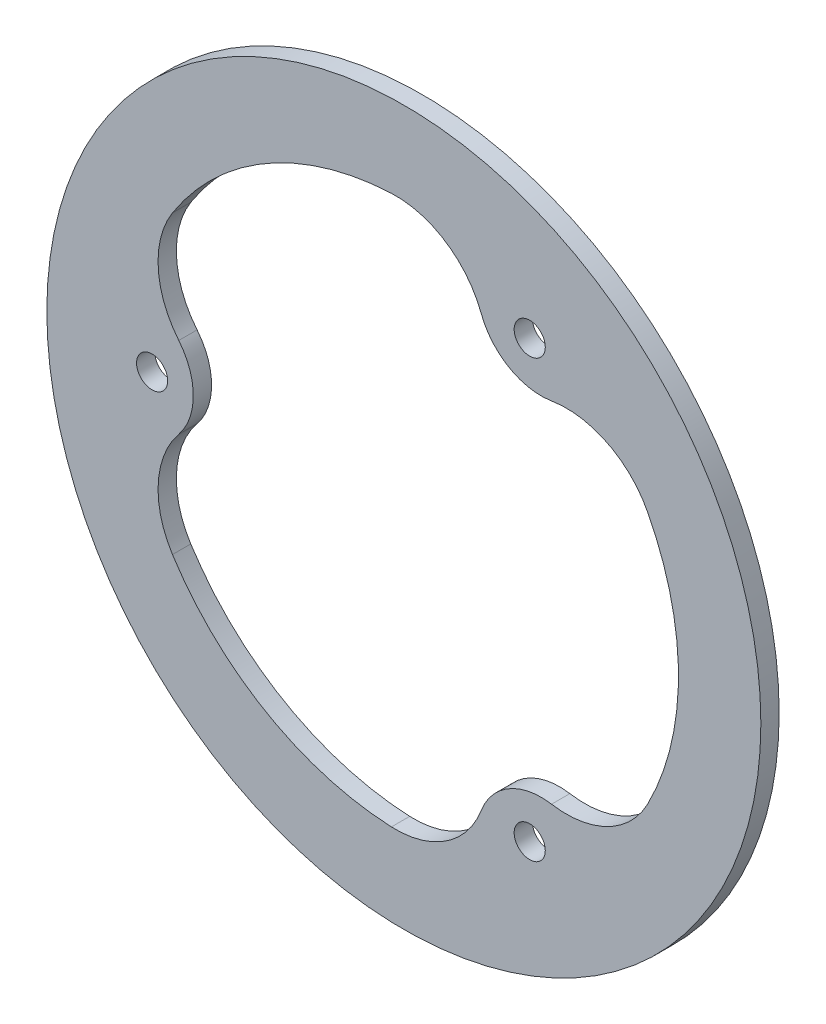
ISO-10303-21;
HEADER;
FILE_DESCRIPTION(('STEP AP214'),'2;1');
FILE_NAME('part.step','',(''),(''),'','','');
FILE_SCHEMA(('AUTOMOTIVE_DESIGN { 1 0 10303 214 1 1 1 1 }'));
ENDSEC;
DATA;
#1=APPLICATION_CONTEXT('core data for automotive mechanical design processes');
#2=APPLICATION_PROTOCOL_DEFINITION('international standard','automotive_design',2000,#1);
#3=PRODUCT_CONTEXT('',#1,'mechanical');
#4=PRODUCT('Part','Part','',(#3));
#5=PRODUCT_RELATED_PRODUCT_CATEGORY('part','',(#4));
#6=PRODUCT_DEFINITION_FORMATION('','',#4);
#7=PRODUCT_DEFINITION_CONTEXT('part definition',#1,'design');
#8=PRODUCT_DEFINITION('design','',#6,#7);
#9=PRODUCT_DEFINITION_SHAPE('','',#8);
#10=(LENGTH_UNIT() NAMED_UNIT(*) SI_UNIT(.MILLI.,.METRE.));
#11=(NAMED_UNIT(*) PLANE_ANGLE_UNIT() SI_UNIT($,.RADIAN.));
#12=(NAMED_UNIT(*) SI_UNIT($,.STERADIAN.) SOLID_ANGLE_UNIT());
#13=UNCERTAINTY_MEASURE_WITH_UNIT(LENGTH_MEASURE(1.E-05),#10,'distance_accuracy_value','');
#14=(GEOMETRIC_REPRESENTATION_CONTEXT(3) GLOBAL_UNCERTAINTY_ASSIGNED_CONTEXT((#13)) GLOBAL_UNIT_ASSIGNED_CONTEXT((#10,
#11,#12)) REPRESENTATION_CONTEXT('',''));
#15=CARTESIAN_POINT('',(0.,0.,0.));
#16=DIRECTION('',(0.,0.,1.));
#17=DIRECTION('',(1.,0.,0.));
#18=AXIS2_PLACEMENT_3D('',#15,#16,#17);
#19=CARTESIAN_POINT('',(0.,0.,2.));
#20=DIRECTION('',(0.,0.,1.));
#21=DIRECTION('',(1.,0.,0.));
#22=AXIS2_PLACEMENT_3D('',#19,#20,#21);
#23=PLANE('',#22);
#24=CARTESIAN_POINT('',(13.7499999999999,23.8156986040721,2.));
#25=DIRECTION('',(0.,0.,1.));
#26=DIRECTION('',(1.,0.,0.));
#27=AXIS2_PLACEMENT_3D('',#24,#25,#26);
#28=CIRCLE('',#27,1.69999999999999);
#29=CARTESIAN_POINT('',(15.4499999999999,23.8156986040721,2.));
#30=VERTEX_POINT('',#29);
#31=EDGE_CURVE('E370',#30,#30,#28,.T.);
#32=ORIENTED_EDGE('',*,*,#31,.F.);
#33=EDGE_LOOP('',(#32));
#34=FACE_BOUND('',#33,.T.);
#35=CARTESIAN_POINT('',(-27.5,0.,2.));
#36=DIRECTION('',(0.,0.,1.));
#37=DIRECTION('',(1.,0.,0.));
#38=AXIS2_PLACEMENT_3D('',#35,#36,#37);
#39=CIRCLE('',#38,1.69999999999999);
#40=CARTESIAN_POINT('',(-25.8,0.,2.));
#41=VERTEX_POINT('',#40);
#42=EDGE_CURVE('E372',#41,#41,#39,.T.);
#43=ORIENTED_EDGE('',*,*,#42,.F.);
#44=EDGE_LOOP('',(#43));
#45=FACE_BOUND('',#44,.T.);
#46=CARTESIAN_POINT('',(13.7499999999999,-23.8156986040721,2.));
#47=DIRECTION('',(0.,0.,1.));
#48=DIRECTION('',(1.,0.,0.));
#49=AXIS2_PLACEMENT_3D('',#46,#47,#48);
#50=CIRCLE('',#49,1.69999999999999);
#51=CARTESIAN_POINT('',(15.4499999999999,-23.8156986040721,2.));
#52=VERTEX_POINT('',#51);
#53=EDGE_CURVE('E379',#52,#52,#50,.T.);
#54=ORIENTED_EDGE('',*,*,#53,.F.);
#55=EDGE_LOOP('',(#54));
#56=FACE_BOUND('',#55,.T.);
#57=CARTESIAN_POINT('',(0.,0.,2.));
#58=DIRECTION('',(0.,0.,1.));
#59=DIRECTION('',(1.,0.,0.));
#60=AXIS2_PLACEMENT_3D('',#57,#58,#59);
#61=CIRCLE('',#60,39.);
#62=CARTESIAN_POINT('',(39.,0.,2.));
#63=VERTEX_POINT('',#62);
#64=EDGE_CURVE('E161',#63,#63,#61,.T.);
#65=ORIENTED_EDGE('',*,*,#64,.T.);
#66=EDGE_LOOP('',(#65));
#67=FACE_BOUND('',#66,.T.);
#68=CARTESIAN_POINT('',(-30.,0.,2.));
#69=DIRECTION('',(0.,0.,-1.));
#70=DIRECTION('',(1.,0.,0.));
#71=AXIS2_PLACEMENT_3D('',#68,#69,#70);
#72=CIRCLE('',#71,7.);
#73=CARTESIAN_POINT('',(-24.5852941176471,4.43632282499961,2.));
#74=VERTEX_POINT('',#73);
#75=CARTESIAN_POINT('',(-24.5852941176471,-4.4363228249996,2.));
#76=VERTEX_POINT('',#75);
#77=EDGE_CURVE('E238',#74,#76,#72,.T.);
#78=ORIENTED_EDGE('',*,*,#77,.F.);
#79=CARTESIAN_POINT('',(-16.85,10.7739268607133,2.));
#80=DIRECTION('',(0.,0.,1.));
#81=DIRECTION('',(1.,0.,0.));
#82=AXIS2_PLACEMENT_3D('',#79,#80,#81);
#83=CIRCLE('',#82,10.);
#84=CARTESIAN_POINT('',(-25.275,16.16089029107,2.));
#85=VERTEX_POINT('',#84);
#86=EDGE_CURVE('E202',#74,#85,#83,.F.);
#87=ORIENTED_EDGE('',*,*,#86,.T.);
#88=CARTESIAN_POINT('',(0.,0.,2.));
#89=DIRECTION('',(0.,0.,1.));
#90=DIRECTION('',(1.,0.,0.));
#91=AXIS2_PLACEMENT_3D('',#88,#89,#90);
#92=CIRCLE('',#91,30.);
#93=CARTESIAN_POINT('',(-1.35824153983997,29.9692372261867,2.));
#94=VERTEX_POINT('',#93);
#95=EDGE_CURVE('E237',#94,#85,#92,.T.);
#96=ORIENTED_EDGE('',*,*,#95,.F.);
#97=CARTESIAN_POINT('',(-0.905494359893315,19.9794914841245,2.));
#98=DIRECTION('',(0.,0.,1.));
#99=DIRECTION('',(1.,0.,0.));
#100=AXIS2_PLACEMENT_3D('',#97,#98,#99);
#101=CIRCLE('',#100,10.);
#102=CARTESIAN_POINT('',(8.45067879298507,23.5096506778943,2.));
#103=VERTEX_POINT('',#102);
#104=EDGE_CURVE('E13',#94,#103,#101,.F.);
#105=ORIENTED_EDGE('',*,*,#104,.T.);
#106=CARTESIAN_POINT('',(14.9999999999999,25.9807621135332,2.));
#107=DIRECTION('',(0.,0.,-1.));
#108=DIRECTION('',(1.,0.,0.));
#109=AXIS2_PLACEMENT_3D('',#106,#107,#108);
#110=CIRCLE('',#109,7.);
#111=CARTESIAN_POINT('',(16.1346153246619,19.0733278528947,2.));
#112=VERTEX_POINT('',#111);
#113=EDGE_CURVE('E222',#112,#103,#110,.T.);
#114=ORIENTED_EDGE('',*,*,#113,.F.);
#115=CARTESIAN_POINT('',(17.7554943598932,9.20556462341117,2.));
#116=DIRECTION('',(0.,0.,1.));
#117=DIRECTION('',(1.,0.,0.));
#118=AXIS2_PLACEMENT_3D('',#115,#116,#117);
#119=CIRCLE('',#118,10.);
#120=CARTESIAN_POINT('',(26.6332415398399,13.8083469351168,2.));
#121=VERTEX_POINT('',#120);
#122=EDGE_CURVE('E206',#112,#121,#119,.F.);
#123=ORIENTED_EDGE('',*,*,#122,.T.);
#124=CARTESIAN_POINT('',(0.,0.,2.));
#125=DIRECTION('',(0.,0.,1.));
#126=DIRECTION('',(1.,0.,0.));
#127=AXIS2_PLACEMENT_3D('',#124,#125,#126);
#128=CIRCLE('',#127,30.);
#129=CARTESIAN_POINT('',(26.6332415398399,-13.8083469351168,2.));
#130=VERTEX_POINT('',#129);
#131=EDGE_CURVE('E224',#130,#121,#128,.T.);
#132=ORIENTED_EDGE('',*,*,#131,.F.);
#133=CARTESIAN_POINT('',(17.7554943598932,-9.20556462341117,2.));
#134=DIRECTION('',(0.,0.,1.));
#135=DIRECTION('',(1.,0.,0.));
#136=AXIS2_PLACEMENT_3D('',#133,#134,#135);
#137=CIRCLE('',#136,10.);
#138=CARTESIAN_POINT('',(16.1346153246619,-19.0733278528947,2.));
#139=VERTEX_POINT('',#138);
#140=EDGE_CURVE('E147',#130,#139,#137,.F.);
#141=ORIENTED_EDGE('',*,*,#140,.T.);
#142=CARTESIAN_POINT('',(14.9999999999999,-25.9807621135332,2.));
#143=DIRECTION('',(0.,0.,-1.));
#144=DIRECTION('',(1.,0.,0.));
#145=AXIS2_PLACEMENT_3D('',#142,#143,#144);
#146=CIRCLE('',#145,7.);
#147=CARTESIAN_POINT('',(8.45067879298507,-23.5096506778943,2.));
#148=VERTEX_POINT('',#147);
#149=EDGE_CURVE('E228',#148,#139,#146,.T.);
#150=ORIENTED_EDGE('',*,*,#149,.F.);
#151=CARTESIAN_POINT('',(-0.905494359893308,-19.9794914841244,2.));
#152=DIRECTION('',(0.,0.,1.));
#153=DIRECTION('',(1.,0.,0.));
#154=AXIS2_PLACEMENT_3D('',#151,#152,#153);
#155=CIRCLE('',#154,10.);
#156=CARTESIAN_POINT('',(-1.35824153983996,-29.9692372261867,2.));
#157=VERTEX_POINT('',#156);
#158=EDGE_CURVE('E146',#148,#157,#155,.F.);
#159=ORIENTED_EDGE('',*,*,#158,.T.);
#160=CARTESIAN_POINT('',(0.,0.,2.));
#161=DIRECTION('',(0.,0.,1.));
#162=DIRECTION('',(1.,0.,0.));
#163=AXIS2_PLACEMENT_3D('',#160,#161,#162);
#164=CIRCLE('',#163,30.);
#165=CARTESIAN_POINT('',(-25.275,-16.16089029107,2.));
#166=VERTEX_POINT('',#165);
#167=EDGE_CURVE('E241',#166,#157,#164,.T.);
#168=ORIENTED_EDGE('',*,*,#167,.F.);
#169=CARTESIAN_POINT('',(-16.85,-10.7739268607133,2.));
#170=DIRECTION('',(0.,0.,1.));
#171=DIRECTION('',(1.,0.,0.));
#172=AXIS2_PLACEMENT_3D('',#169,#170,#171);
#173=CIRCLE('',#172,10.);
#174=EDGE_CURVE('E198',#166,#76,#173,.F.);
#175=ORIENTED_EDGE('',*,*,#174,.T.);
#176=EDGE_LOOP('',(#78,#87,#96,#105,#114,#123,#132,#141,#150,#159,#168,#175));
#177=FACE_BOUND('',#176,.T.);
#178=ADVANCED_FACE('F46',(#34,#45,#56,#67,#177),#23,.T.);
#179=CARTESIAN_POINT('',(0.,0.,0.));
#180=DIRECTION('',(0.,0.,1.));
#181=DIRECTION('',(1.,0.,0.));
#182=AXIS2_PLACEMENT_3D('',#179,#180,#181);
#183=PLANE('',#182);
#184=CARTESIAN_POINT('',(13.7499999999999,23.8156986040721,0.));
#185=DIRECTION('',(0.,0.,1.));
#186=DIRECTION('',(1.,0.,0.));
#187=AXIS2_PLACEMENT_3D('',#184,#185,#186);
#188=CIRCLE('',#187,1.7);
#189=CARTESIAN_POINT('',(15.4499999999999,23.8156986040721,0.));
#190=VERTEX_POINT('',#189);
#191=EDGE_CURVE('E368',#190,#190,#188,.T.);
#192=ORIENTED_EDGE('',*,*,#191,.T.);
#193=EDGE_LOOP('',(#192));
#194=FACE_BOUND('',#193,.T.);
#195=CARTESIAN_POINT('',(-27.5,0.,0.));
#196=DIRECTION('',(0.,0.,1.));
#197=DIRECTION('',(1.,0.,0.));
#198=AXIS2_PLACEMENT_3D('',#195,#196,#197);
#199=CIRCLE('',#198,1.7);
#200=CARTESIAN_POINT('',(-25.8,0.,0.));
#201=VERTEX_POINT('',#200);
#202=EDGE_CURVE('E377',#201,#201,#199,.T.);
#203=ORIENTED_EDGE('',*,*,#202,.T.);
#204=EDGE_LOOP('',(#203));
#205=FACE_BOUND('',#204,.T.);
#206=CARTESIAN_POINT('',(13.7499999999999,-23.8156986040721,0.));
#207=DIRECTION('',(0.,0.,1.));
#208=DIRECTION('',(1.,0.,0.));
#209=AXIS2_PLACEMENT_3D('',#206,#207,#208);
#210=CIRCLE('',#209,1.7);
#211=CARTESIAN_POINT('',(15.4499999999999,-23.8156986040721,0.));
#212=VERTEX_POINT('',#211);
#213=EDGE_CURVE('E219',#212,#212,#210,.T.);
#214=ORIENTED_EDGE('',*,*,#213,.T.);
#215=EDGE_LOOP('',(#214));
#216=FACE_BOUND('',#215,.T.);
#217=CARTESIAN_POINT('',(0.,0.,0.));
#218=DIRECTION('',(0.,0.,1.));
#219=DIRECTION('',(1.,0.,0.));
#220=AXIS2_PLACEMENT_3D('',#217,#218,#219);
#221=CIRCLE('',#220,39.);
#222=CARTESIAN_POINT('',(39.,0.,0.));
#223=VERTEX_POINT('',#222);
#224=EDGE_CURVE('E166',#223,#223,#221,.T.);
#225=ORIENTED_EDGE('',*,*,#224,.F.);
#226=EDGE_LOOP('',(#225));
#227=FACE_BOUND('',#226,.T.);
#228=CARTESIAN_POINT('',(14.9999999999999,25.9807621135332,0.));
#229=DIRECTION('',(0.,0.,-1.));
#230=DIRECTION('',(1.,0.,0.));
#231=AXIS2_PLACEMENT_3D('',#228,#229,#230);
#232=CIRCLE('',#231,7.);
#233=CARTESIAN_POINT('',(16.1346153246619,19.0733278528947,0.));
#234=VERTEX_POINT('',#233);
#235=CARTESIAN_POINT('',(8.45067879298507,23.5096506778943,0.));
#236=VERTEX_POINT('',#235);
#237=EDGE_CURVE('E210',#234,#236,#232,.T.);
#238=ORIENTED_EDGE('',*,*,#237,.T.);
#239=CARTESIAN_POINT('',(-0.905494359893315,19.9794914841245,0.));
#240=DIRECTION('',(0.,0.,1.));
#241=DIRECTION('',(1.,0.,0.));
#242=AXIS2_PLACEMENT_3D('',#239,#240,#241);
#243=CIRCLE('',#242,10.);
#244=CARTESIAN_POINT('',(-1.35824153983997,29.9692372261867,0.));
#245=VERTEX_POINT('',#244);
#246=EDGE_CURVE('E54',#236,#245,#243,.T.);
#247=ORIENTED_EDGE('',*,*,#246,.T.);
#248=CARTESIAN_POINT('',(0.,0.,0.));
#249=DIRECTION('',(0.,0.,1.));
#250=DIRECTION('',(1.,0.,0.));
#251=AXIS2_PLACEMENT_3D('',#248,#249,#250);
#252=CIRCLE('',#251,30.);
#253=CARTESIAN_POINT('',(-25.275,16.16089029107,0.));
#254=VERTEX_POINT('',#253);
#255=EDGE_CURVE('E209',#245,#254,#252,.T.);
#256=ORIENTED_EDGE('',*,*,#255,.T.);
#257=CARTESIAN_POINT('',(-16.85,10.7739268607133,0.));
#258=DIRECTION('',(0.,0.,1.));
#259=DIRECTION('',(1.,0.,0.));
#260=AXIS2_PLACEMENT_3D('',#257,#258,#259);
#261=CIRCLE('',#260,10.);
#262=CARTESIAN_POINT('',(-24.5852941176471,4.43632282499961,0.));
#263=VERTEX_POINT('',#262);
#264=EDGE_CURVE('E200',#254,#263,#261,.T.);
#265=ORIENTED_EDGE('',*,*,#264,.T.);
#266=CARTESIAN_POINT('',(-30.,0.,0.));
#267=DIRECTION('',(0.,0.,-1.));
#268=DIRECTION('',(1.,0.,0.));
#269=AXIS2_PLACEMENT_3D('',#266,#267,#268);
#270=CIRCLE('',#269,7.);
#271=CARTESIAN_POINT('',(-24.5852941176471,-4.4363228249996,0.));
#272=VERTEX_POINT('',#271);
#273=EDGE_CURVE('E218',#263,#272,#270,.T.);
#274=ORIENTED_EDGE('',*,*,#273,.T.);
#275=CARTESIAN_POINT('',(-16.85,-10.7739268607133,0.));
#276=DIRECTION('',(0.,0.,1.));
#277=DIRECTION('',(1.,0.,0.));
#278=AXIS2_PLACEMENT_3D('',#275,#276,#277);
#279=CIRCLE('',#278,10.);
#280=CARTESIAN_POINT('',(-25.275,-16.16089029107,0.));
#281=VERTEX_POINT('',#280);
#282=EDGE_CURVE('E196',#272,#281,#279,.T.);
#283=ORIENTED_EDGE('',*,*,#282,.T.);
#284=CARTESIAN_POINT('',(0.,0.,0.));
#285=DIRECTION('',(0.,0.,1.));
#286=DIRECTION('',(1.,0.,0.));
#287=AXIS2_PLACEMENT_3D('',#284,#285,#286);
#288=CIRCLE('',#287,30.);
#289=CARTESIAN_POINT('',(-1.35824153983996,-29.9692372261867,0.));
#290=VERTEX_POINT('',#289);
#291=EDGE_CURVE('E141',#281,#290,#288,.T.);
#292=ORIENTED_EDGE('',*,*,#291,.T.);
#293=CARTESIAN_POINT('',(-0.905494359893308,-19.9794914841244,0.));
#294=DIRECTION('',(0.,0.,1.));
#295=DIRECTION('',(1.,0.,0.));
#296=AXIS2_PLACEMENT_3D('',#293,#294,#295);
#297=CIRCLE('',#296,10.);
#298=CARTESIAN_POINT('',(8.45067879298507,-23.5096506778943,0.));
#299=VERTEX_POINT('',#298);
#300=EDGE_CURVE('E135',#290,#299,#297,.T.);
#301=ORIENTED_EDGE('',*,*,#300,.T.);
#302=CARTESIAN_POINT('',(14.9999999999999,-25.9807621135332,0.));
#303=DIRECTION('',(0.,0.,-1.));
#304=DIRECTION('',(1.,0.,0.));
#305=AXIS2_PLACEMENT_3D('',#302,#303,#304);
#306=CIRCLE('',#305,7.);
#307=CARTESIAN_POINT('',(16.1346153246619,-19.0733278528947,0.));
#308=VERTEX_POINT('',#307);
#309=EDGE_CURVE('E139',#299,#308,#306,.T.);
#310=ORIENTED_EDGE('',*,*,#309,.T.);
#311=CARTESIAN_POINT('',(17.7554943598932,-9.20556462341117,0.));
#312=DIRECTION('',(0.,0.,1.));
#313=DIRECTION('',(1.,0.,0.));
#314=AXIS2_PLACEMENT_3D('',#311,#312,#313);
#315=CIRCLE('',#314,10.);
#316=CARTESIAN_POINT('',(26.6332415398399,-13.8083469351168,0.));
#317=VERTEX_POINT('',#316);
#318=EDGE_CURVE('E192',#308,#317,#315,.T.);
#319=ORIENTED_EDGE('',*,*,#318,.T.);
#320=CARTESIAN_POINT('',(0.,0.,0.));
#321=DIRECTION('',(0.,0.,1.));
#322=DIRECTION('',(1.,0.,0.));
#323=AXIS2_PLACEMENT_3D('',#320,#321,#322);
#324=CIRCLE('',#323,30.);
#325=CARTESIAN_POINT('',(26.6332415398399,13.8083469351168,0.));
#326=VERTEX_POINT('',#325);
#327=EDGE_CURVE('E157',#317,#326,#324,.T.);
#328=ORIENTED_EDGE('',*,*,#327,.T.);
#329=CARTESIAN_POINT('',(17.7554943598932,9.20556462341117,0.));
#330=DIRECTION('',(0.,0.,1.));
#331=DIRECTION('',(1.,0.,0.));
#332=AXIS2_PLACEMENT_3D('',#329,#330,#331);
#333=CIRCLE('',#332,10.);
#334=EDGE_CURVE('E204',#326,#234,#333,.T.);
#335=ORIENTED_EDGE('',*,*,#334,.T.);
#336=EDGE_LOOP('',(#238,#247,#256,#265,#274,#283,#292,#301,#310,#319,#328,#335));
#337=FACE_BOUND('',#336,.T.);
#338=ADVANCED_FACE('F138',(#194,#205,#216,#227,#337),#183,.F.);
#339=CARTESIAN_POINT('',(0.,0.,2.));
#340=DIRECTION('',(0.,0.,-1.));
#341=DIRECTION('',(-1.,0.,0.));
#342=AXIS2_PLACEMENT_3D('',#339,#340,#341);
#343=CYLINDRICAL_SURFACE('',#342,39.);
#344=ORIENTED_EDGE('',*,*,#64,.F.);
#345=EDGE_LOOP('',(#344));
#346=FACE_BOUND('',#345,.T.);
#347=ORIENTED_EDGE('',*,*,#224,.T.);
#348=EDGE_LOOP('',(#347));
#349=FACE_BOUND('',#348,.T.);
#350=ADVANCED_FACE('F266',(#346,#349),#343,.T.);
#351=CARTESIAN_POINT('',(0.,0.,2.));
#352=DIRECTION('',(0.,0.,-1.));
#353=DIRECTION('',(-1.,0.,0.));
#354=AXIS2_PLACEMENT_3D('',#351,#352,#353);
#355=CYLINDRICAL_SURFACE('',#354,30.);
#356=ORIENTED_EDGE('',*,*,#95,.T.);
#357=DIRECTION('',(0.,0.,-1.));
#358=VECTOR('',#357,1.);
#359=CARTESIAN_POINT('',(-25.275,16.16089029107,2.));
#360=LINE('',#359,#358);
#361=EDGE_CURVE('E185',#85,#254,#360,.T.);
#362=ORIENTED_EDGE('',*,*,#361,.T.);
#363=ORIENTED_EDGE('',*,*,#255,.F.);
#364=DIRECTION('',(0.,0.,-1.));
#365=VECTOR('',#364,1.);
#366=CARTESIAN_POINT('',(-1.35824153983997,29.9692372261867,2.));
#367=LINE('',#366,#365);
#368=EDGE_CURVE('E183',#245,#94,#367,.F.);
#369=ORIENTED_EDGE('',*,*,#368,.T.);
#370=EDGE_LOOP('',(#356,#362,#363,#369));
#371=FACE_BOUND('',#370,.T.);
#372=ADVANCED_FACE('F216',(#371),#355,.F.);
#373=CARTESIAN_POINT('',(-30.,0.,2.));
#374=DIRECTION('',(0.,0.,-1.));
#375=DIRECTION('',(-1.,0.,0.));
#376=AXIS2_PLACEMENT_3D('',#373,#374,#375);
#377=CYLINDRICAL_SURFACE('',#376,7.);
#378=ORIENTED_EDGE('',*,*,#77,.T.);
#379=DIRECTION('',(0.,0.,-1.));
#380=VECTOR('',#379,1.);
#381=CARTESIAN_POINT('',(-24.5852941176471,-4.4363228249996,2.));
#382=LINE('',#381,#380);
#383=EDGE_CURVE('E180',#76,#272,#382,.T.);
#384=ORIENTED_EDGE('',*,*,#383,.T.);
#385=ORIENTED_EDGE('',*,*,#273,.F.);
#386=DIRECTION('',(0.,0.,-1.));
#387=VECTOR('',#386,1.);
#388=CARTESIAN_POINT('',(-24.5852941176471,4.43632282499961,2.));
#389=LINE('',#388,#387);
#390=EDGE_CURVE('E178',#263,#74,#389,.F.);
#391=ORIENTED_EDGE('',*,*,#390,.T.);
#392=EDGE_LOOP('',(#378,#384,#385,#391));
#393=FACE_BOUND('',#392,.T.);
#394=ADVANCED_FACE('F317',(#393),#377,.T.);
#395=CARTESIAN_POINT('',(0.,0.,2.));
#396=DIRECTION('',(0.,0.,-1.));
#397=DIRECTION('',(-1.,0.,0.));
#398=AXIS2_PLACEMENT_3D('',#395,#396,#397);
#399=CYLINDRICAL_SURFACE('',#398,30.);
#400=ORIENTED_EDGE('',*,*,#167,.T.);
#401=DIRECTION('',(0.,0.,-1.));
#402=VECTOR('',#401,1.);
#403=CARTESIAN_POINT('',(-1.35824153983996,-29.9692372261867,2.));
#404=LINE('',#403,#402);
#405=EDGE_CURVE('E176',#157,#290,#404,.T.);
#406=ORIENTED_EDGE('',*,*,#405,.T.);
#407=ORIENTED_EDGE('',*,*,#291,.F.);
#408=DIRECTION('',(0.,0.,-1.));
#409=VECTOR('',#408,1.);
#410=CARTESIAN_POINT('',(-25.275,-16.16089029107,2.));
#411=LINE('',#410,#409);
#412=EDGE_CURVE('E174',#281,#166,#411,.F.);
#413=ORIENTED_EDGE('',*,*,#412,.T.);
#414=EDGE_LOOP('',(#400,#406,#407,#413));
#415=FACE_BOUND('',#414,.T.);
#416=ADVANCED_FACE('F315',(#415),#399,.F.);
#417=CARTESIAN_POINT('',(14.9999999999999,-25.9807621135332,2.));
#418=DIRECTION('',(0.,0.,-1.));
#419=DIRECTION('',(-1.,0.,0.));
#420=AXIS2_PLACEMENT_3D('',#417,#418,#419);
#421=CYLINDRICAL_SURFACE('',#420,7.);
#422=ORIENTED_EDGE('',*,*,#149,.T.);
#423=DIRECTION('',(0.,0.,-1.));
#424=VECTOR('',#423,1.);
#425=CARTESIAN_POINT('',(16.1346153246619,-19.0733278528947,2.));
#426=LINE('',#425,#424);
#427=EDGE_CURVE('E156',#139,#308,#426,.T.);
#428=ORIENTED_EDGE('',*,*,#427,.T.);
#429=ORIENTED_EDGE('',*,*,#309,.F.);
#430=DIRECTION('',(0.,0.,-1.));
#431=VECTOR('',#430,1.);
#432=CARTESIAN_POINT('',(8.45067879298507,-23.5096506778943,2.));
#433=LINE('',#432,#431);
#434=EDGE_CURVE('E153',#299,#148,#433,.F.);
#435=ORIENTED_EDGE('',*,*,#434,.T.);
#436=EDGE_LOOP('',(#422,#428,#429,#435));
#437=FACE_BOUND('',#436,.T.);
#438=ADVANCED_FACE('F152',(#437),#421,.T.);
#439=CARTESIAN_POINT('',(0.,0.,2.));
#440=DIRECTION('',(0.,0.,-1.));
#441=DIRECTION('',(-1.,0.,0.));
#442=AXIS2_PLACEMENT_3D('',#439,#440,#441);
#443=CYLINDRICAL_SURFACE('',#442,30.);
#444=ORIENTED_EDGE('',*,*,#327,.F.);
#445=DIRECTION('',(0.,0.,-1.));
#446=VECTOR('',#445,1.);
#447=CARTESIAN_POINT('',(26.6332415398399,-13.8083469351168,2.));
#448=LINE('',#447,#446);
#449=EDGE_CURVE('E172',#317,#130,#448,.F.);
#450=ORIENTED_EDGE('',*,*,#449,.T.);
#451=ORIENTED_EDGE('',*,*,#131,.T.);
#452=DIRECTION('',(0.,0.,-1.));
#453=VECTOR('',#452,1.);
#454=CARTESIAN_POINT('',(26.6332415398399,13.8083469351168,2.));
#455=LINE('',#454,#453);
#456=EDGE_CURVE('E163',#121,#326,#455,.T.);
#457=ORIENTED_EDGE('',*,*,#456,.T.);
#458=EDGE_LOOP('',(#444,#450,#451,#457));
#459=FACE_BOUND('',#458,.T.);
#460=ADVANCED_FACE('F253',(#459),#443,.F.);
#461=CARTESIAN_POINT('',(14.9999999999999,25.9807621135332,2.));
#462=DIRECTION('',(0.,0.,-1.));
#463=DIRECTION('',(-1.,0.,0.));
#464=AXIS2_PLACEMENT_3D('',#461,#462,#463);
#465=CYLINDRICAL_SURFACE('',#464,7.);
#466=ORIENTED_EDGE('',*,*,#237,.F.);
#467=DIRECTION('',(0.,0.,-1.));
#468=VECTOR('',#467,1.);
#469=CARTESIAN_POINT('',(16.1346153246619,19.0733278528947,2.));
#470=LINE('',#469,#468);
#471=EDGE_CURVE('E66',#234,#112,#470,.F.);
#472=ORIENTED_EDGE('',*,*,#471,.T.);
#473=ORIENTED_EDGE('',*,*,#113,.T.);
#474=DIRECTION('',(0.,0.,-1.));
#475=VECTOR('',#474,1.);
#476=CARTESIAN_POINT('',(8.45067879298507,23.5096506778943,2.));
#477=LINE('',#476,#475);
#478=EDGE_CURVE('E188',#103,#236,#477,.T.);
#479=ORIENTED_EDGE('',*,*,#478,.T.);
#480=EDGE_LOOP('',(#466,#472,#473,#479));
#481=FACE_BOUND('',#480,.T.);
#482=ADVANCED_FACE('F221',(#481),#465,.T.);
#483=CARTESIAN_POINT('',(17.7554943598932,-9.20556462341117,2.));
#484=DIRECTION('',(0.,0.,-1.));
#485=DIRECTION('',(-1.,0.,0.));
#486=AXIS2_PLACEMENT_3D('',#483,#484,#485);
#487=CYLINDRICAL_SURFACE('',#486,10.);
#488=ORIENTED_EDGE('',*,*,#140,.F.);
#489=ORIENTED_EDGE('',*,*,#449,.F.);
#490=ORIENTED_EDGE('',*,*,#318,.F.);
#491=ORIENTED_EDGE('',*,*,#427,.F.);
#492=EDGE_LOOP('',(#488,#489,#490,#491));
#493=FACE_BOUND('',#492,.T.);
#494=ADVANCED_FACE('F249',(#493),#487,.F.);
#495=CARTESIAN_POINT('',(-0.905494359893308,-19.9794914841244,2.));
#496=DIRECTION('',(0.,0.,-1.));
#497=DIRECTION('',(-1.,0.,0.));
#498=AXIS2_PLACEMENT_3D('',#495,#496,#497);
#499=CYLINDRICAL_SURFACE('',#498,10.);
#500=ORIENTED_EDGE('',*,*,#158,.F.);
#501=ORIENTED_EDGE('',*,*,#434,.F.);
#502=ORIENTED_EDGE('',*,*,#300,.F.);
#503=ORIENTED_EDGE('',*,*,#405,.F.);
#504=EDGE_LOOP('',(#500,#501,#502,#503));
#505=FACE_BOUND('',#504,.T.);
#506=ADVANCED_FACE('F160',(#505),#499,.F.);
#507=CARTESIAN_POINT('',(-16.85,-10.7739268607133,2.));
#508=DIRECTION('',(0.,0.,-1.));
#509=DIRECTION('',(-1.,0.,0.));
#510=AXIS2_PLACEMENT_3D('',#507,#508,#509);
#511=CYLINDRICAL_SURFACE('',#510,10.);
#512=ORIENTED_EDGE('',*,*,#174,.F.);
#513=ORIENTED_EDGE('',*,*,#412,.F.);
#514=ORIENTED_EDGE('',*,*,#282,.F.);
#515=ORIENTED_EDGE('',*,*,#383,.F.);
#516=EDGE_LOOP('',(#512,#513,#514,#515));
#517=FACE_BOUND('',#516,.T.);
#518=ADVANCED_FACE('F281',(#517),#511,.F.);
#519=CARTESIAN_POINT('',(-16.85,10.7739268607133,2.));
#520=DIRECTION('',(0.,0.,-1.));
#521=DIRECTION('',(-1.,0.,0.));
#522=AXIS2_PLACEMENT_3D('',#519,#520,#521);
#523=CYLINDRICAL_SURFACE('',#522,10.);
#524=ORIENTED_EDGE('',*,*,#86,.F.);
#525=ORIENTED_EDGE('',*,*,#390,.F.);
#526=ORIENTED_EDGE('',*,*,#264,.F.);
#527=ORIENTED_EDGE('',*,*,#361,.F.);
#528=EDGE_LOOP('',(#524,#525,#526,#527));
#529=FACE_BOUND('',#528,.T.);
#530=ADVANCED_FACE('F284',(#529),#523,.F.);
#531=CARTESIAN_POINT('',(17.7554943598932,9.20556462341117,2.));
#532=DIRECTION('',(0.,0.,-1.));
#533=DIRECTION('',(-1.,0.,0.));
#534=AXIS2_PLACEMENT_3D('',#531,#532,#533);
#535=CYLINDRICAL_SURFACE('',#534,10.);
#536=ORIENTED_EDGE('',*,*,#122,.F.);
#537=ORIENTED_EDGE('',*,*,#471,.F.);
#538=ORIENTED_EDGE('',*,*,#334,.F.);
#539=ORIENTED_EDGE('',*,*,#456,.F.);
#540=EDGE_LOOP('',(#536,#537,#538,#539));
#541=FACE_BOUND('',#540,.T.);
#542=ADVANCED_FACE('F257',(#541),#535,.F.);
#543=CARTESIAN_POINT('',(-0.905494359893315,19.9794914841245,2.));
#544=DIRECTION('',(0.,0.,-1.));
#545=DIRECTION('',(-1.,0.,0.));
#546=AXIS2_PLACEMENT_3D('',#543,#544,#545);
#547=CYLINDRICAL_SURFACE('',#546,10.);
#548=ORIENTED_EDGE('',*,*,#104,.F.);
#549=ORIENTED_EDGE('',*,*,#368,.F.);
#550=ORIENTED_EDGE('',*,*,#246,.F.);
#551=ORIENTED_EDGE('',*,*,#478,.F.);
#552=EDGE_LOOP('',(#548,#549,#550,#551));
#553=FACE_BOUND('',#552,.T.);
#554=ADVANCED_FACE('F48',(#553),#547,.F.);
#555=CARTESIAN_POINT('',(13.7499999999999,-23.8156986040721,2.));
#556=DIRECTION('',(0.,0.,1.));
#557=DIRECTION('',(1.,0.,0.));
#558=AXIS2_PLACEMENT_3D('',#555,#556,#557);
#559=CYLINDRICAL_SURFACE('',#558,1.69999999999999);
#560=ORIENTED_EDGE('',*,*,#213,.F.);
#561=EDGE_LOOP('',(#560));
#562=FACE_BOUND('',#561,.T.);
#563=ORIENTED_EDGE('',*,*,#53,.T.);
#564=EDGE_LOOP('',(#563));
#565=FACE_BOUND('',#564,.T.);
#566=ADVANCED_FACE('F292',(#562,#565),#559,.F.);
#567=CARTESIAN_POINT('',(-27.5,0.,2.));
#568=DIRECTION('',(0.,0.,1.));
#569=DIRECTION('',(1.,0.,0.));
#570=AXIS2_PLACEMENT_3D('',#567,#568,#569);
#571=CYLINDRICAL_SURFACE('',#570,1.69999999999999);
#572=ORIENTED_EDGE('',*,*,#202,.F.);
#573=EDGE_LOOP('',(#572));
#574=FACE_BOUND('',#573,.T.);
#575=ORIENTED_EDGE('',*,*,#42,.T.);
#576=EDGE_LOOP('',(#575));
#577=FACE_BOUND('',#576,.T.);
#578=ADVANCED_FACE('F296',(#574,#577),#571,.F.);
#579=CARTESIAN_POINT('',(13.7499999999999,23.8156986040721,2.));
#580=DIRECTION('',(0.,0.,1.));
#581=DIRECTION('',(1.,0.,0.));
#582=AXIS2_PLACEMENT_3D('',#579,#580,#581);
#583=CYLINDRICAL_SURFACE('',#582,1.69999999999999);
#584=ORIENTED_EDGE('',*,*,#191,.F.);
#585=EDGE_LOOP('',(#584));
#586=FACE_BOUND('',#585,.T.);
#587=ORIENTED_EDGE('',*,*,#31,.T.);
#588=EDGE_LOOP('',(#587));
#589=FACE_BOUND('',#588,.T.);
#590=ADVANCED_FACE('F302',(#586,#589),#583,.F.);
#591=CLOSED_SHELL('',(#178,#338,#350,#372,#394,#416,#438,#460,#482,#494,#506,#518,#530,#542,
#554,#566,#578,#590));
#592=MANIFOLD_SOLID_BREP('B2',#591);
#593=ADVANCED_BREP_SHAPE_REPRESENTATION('',(#18,#592),#14);
#594=SHAPE_DEFINITION_REPRESENTATION(#9,#593);
ENDSEC;
END-ISO-10303-21;
